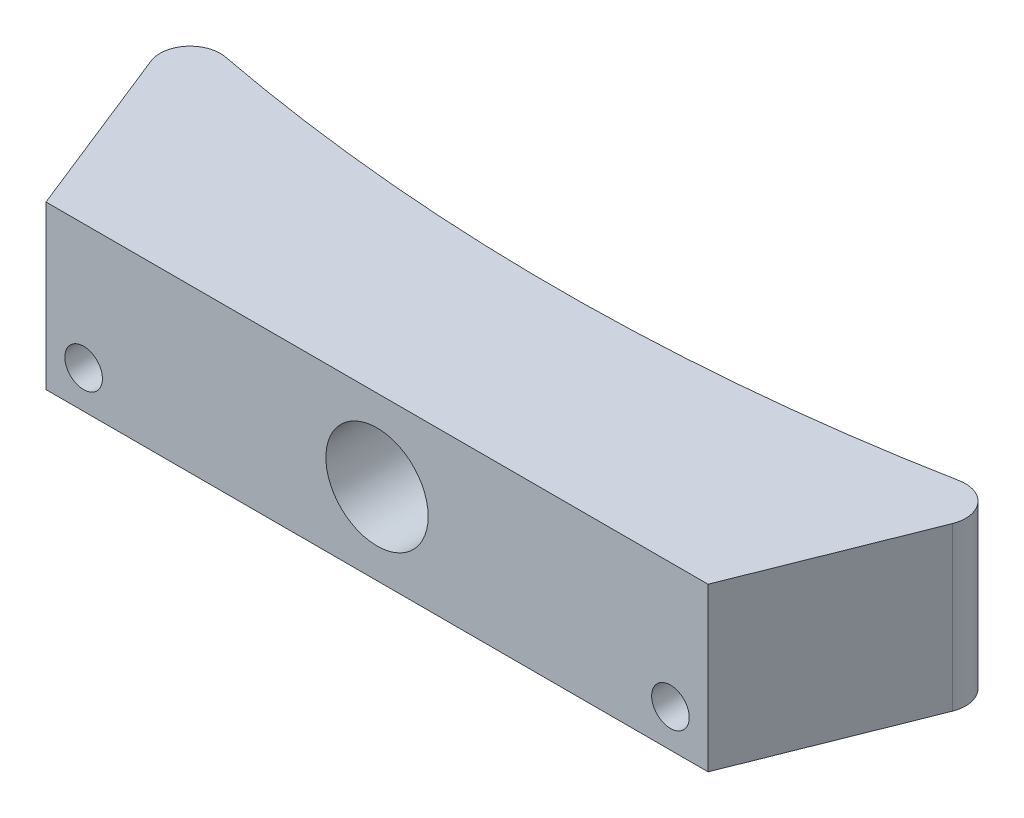
ISO-10303-21;
HEADER;
FILE_DESCRIPTION(('STEP AP214'),'2;1');
FILE_NAME('part.step','',(''),(''),'','','');
FILE_SCHEMA(('AUTOMOTIVE_DESIGN { 1 0 10303 214 1 1 1 1 }'));
ENDSEC;
DATA;
#1=APPLICATION_CONTEXT('core data for automotive mechanical design processes');
#2=APPLICATION_PROTOCOL_DEFINITION('international standard','automotive_design',2000,#1);
#3=PRODUCT_CONTEXT('',#1,'mechanical');
#4=PRODUCT('Part','Part','',(#3));
#5=PRODUCT_RELATED_PRODUCT_CATEGORY('part','',(#4));
#6=PRODUCT_DEFINITION_FORMATION('','',#4);
#7=PRODUCT_DEFINITION_CONTEXT('part definition',#1,'design');
#8=PRODUCT_DEFINITION('design','',#6,#7);
#9=PRODUCT_DEFINITION_SHAPE('','',#8);
#10=(LENGTH_UNIT() NAMED_UNIT(*) SI_UNIT(.MILLI.,.METRE.));
#11=(NAMED_UNIT(*) PLANE_ANGLE_UNIT() SI_UNIT($,.RADIAN.));
#12=(NAMED_UNIT(*) SI_UNIT($,.STERADIAN.) SOLID_ANGLE_UNIT());
#13=UNCERTAINTY_MEASURE_WITH_UNIT(LENGTH_MEASURE(1.E-05),#10,'distance_accuracy_value','');
#14=(GEOMETRIC_REPRESENTATION_CONTEXT(3) GLOBAL_UNCERTAINTY_ASSIGNED_CONTEXT((#13)) GLOBAL_UNIT_ASSIGNED_CONTEXT((#10,
#11,#12)) REPRESENTATION_CONTEXT('',''));
#15=CARTESIAN_POINT('',(0.,0.,0.));
#16=DIRECTION('',(0.,0.,1.));
#17=DIRECTION('',(1.,0.,0.));
#18=AXIS2_PLACEMENT_3D('',#15,#16,#17);
#19=CARTESIAN_POINT('',(-22.,5.4,0.));
#20=DIRECTION('',(0.,0.,1.));
#21=DIRECTION('',(1.,0.,0.));
#22=AXIS2_PLACEMENT_3D('',#19,#20,#21);
#23=PLANE('',#22);
#24=CARTESIAN_POINT('',(0.,0.,0.));
#25=DIRECTION('',(0.,0.,1.));
#26=DIRECTION('',(1.,0.,0.));
#27=AXIS2_PLACEMENT_3D('',#24,#25,#26);
#28=CIRCLE('',#27,3.4);
#29=CARTESIAN_POINT('',(3.4,0.,0.));
#30=VERTEX_POINT('',#29);
#31=EDGE_CURVE('E109',#30,#30,#28,.T.);
#32=ORIENTED_EDGE('',*,*,#31,.F.);
#33=EDGE_LOOP('',(#32));
#34=FACE_BOUND('',#33,.T.);
#35=DIRECTION('',(-1.,0.,0.));
#36=VECTOR('',#35,1.);
#37=CARTESIAN_POINT('',(-22.,5.4,0.));
#38=LINE('',#37,#36);
#39=CARTESIAN_POINT('',(22.,5.4,0.));
#40=VERTEX_POINT('',#39);
#41=CARTESIAN_POINT('',(-22.,5.4,0.));
#42=VERTEX_POINT('',#41);
#43=EDGE_CURVE('E134',#40,#42,#38,.T.);
#44=ORIENTED_EDGE('',*,*,#43,.T.);
#45=DIRECTION('',(0.,-1.,0.));
#46=VECTOR('',#45,1.);
#47=CARTESIAN_POINT('',(-22.,5.4,0.));
#48=LINE('',#47,#46);
#49=CARTESIAN_POINT('',(-22.,-5.4,0.));
#50=VERTEX_POINT('',#49);
#51=EDGE_CURVE('E145',#42,#50,#48,.T.);
#52=ORIENTED_EDGE('',*,*,#51,.T.);
#53=DIRECTION('',(-1.,0.,0.));
#54=VECTOR('',#53,1.);
#55=CARTESIAN_POINT('',(-22.,-5.4,0.));
#56=LINE('',#55,#54);
#57=CARTESIAN_POINT('',(22.,-5.4,0.));
#58=VERTEX_POINT('',#57);
#59=EDGE_CURVE('E130',#58,#50,#56,.T.);
#60=ORIENTED_EDGE('',*,*,#59,.F.);
#61=DIRECTION('',(0.,-1.,0.));
#62=VECTOR('',#61,1.);
#63=CARTESIAN_POINT('',(22.,5.4,0.));
#64=LINE('',#63,#62);
#65=EDGE_CURVE('E136',#40,#58,#64,.T.);
#66=ORIENTED_EDGE('',*,*,#65,.F.);
#67=EDGE_LOOP('',(#44,#52,#60,#66));
#68=FACE_BOUND('',#67,.T.);
#69=CARTESIAN_POINT('',(-19.5,-2.9,0.));
#70=DIRECTION('',(0.,0.,1.));
#71=DIRECTION('',(1.,0.,0.));
#72=AXIS2_PLACEMENT_3D('',#69,#70,#71);
#73=CIRCLE('',#72,1.25);
#74=CARTESIAN_POINT('',(-18.25,-2.9,0.));
#75=VERTEX_POINT('',#74);
#76=EDGE_CURVE('E108',#75,#75,#73,.T.);
#77=ORIENTED_EDGE('',*,*,#76,.F.);
#78=EDGE_LOOP('',(#77));
#79=FACE_BOUND('',#78,.T.);
#80=CARTESIAN_POINT('',(19.5,-2.9,0.));
#81=DIRECTION('',(0.,0.,1.));
#82=DIRECTION('',(1.,0.,0.));
#83=AXIS2_PLACEMENT_3D('',#80,#81,#82);
#84=CIRCLE('',#83,1.25);
#85=CARTESIAN_POINT('',(20.75,-2.9,0.));
#86=VERTEX_POINT('',#85);
#87=EDGE_CURVE('E119',#86,#86,#84,.T.);
#88=ORIENTED_EDGE('',*,*,#87,.F.);
#89=EDGE_LOOP('',(#88));
#90=FACE_BOUND('',#89,.T.);
#91=ADVANCED_FACE('F38',(#34,#68,#79,#90),#23,.T.);
#92=CARTESIAN_POINT('',(-22.,5.4,0.));
#93=DIRECTION('',(-0.928911827201936,0.,0.370300982019168));
#94=DIRECTION('',(0.370300982019168,0.,0.928911827201936));
#95=AXIS2_PLACEMENT_3D('',#92,#93,#94);
#96=PLANE('',#95);
#97=DIRECTION('',(-0.370300982019168,0.,-0.928911827201936));
#98=VECTOR('',#97,1.);
#99=CARTESIAN_POINT('',(-22.,5.4,0.));
#100=LINE('',#99,#98);
#101=CARTESIAN_POINT('',(-26.6257725120182,5.4,-11.6038979236001));
#102=VERTEX_POINT('',#101);
#103=EDGE_CURVE('E126',#42,#102,#100,.T.);
#104=ORIENTED_EDGE('',*,*,#103,.T.);
#105=DIRECTION('',(0.,-1.,0.));
#106=VECTOR('',#105,1.);
#107=CARTESIAN_POINT('',(-26.6257725120182,5.4,-11.6038979236001));
#108=LINE('',#107,#106);
#109=CARTESIAN_POINT('',(-26.6257725120182,-5.4,-11.6038979236001));
#110=VERTEX_POINT('',#109);
#111=EDGE_CURVE('E148',#102,#110,#108,.T.);
#112=ORIENTED_EDGE('',*,*,#111,.T.);
#113=DIRECTION('',(-0.370300982019168,0.,-0.928911827201936));
#114=VECTOR('',#113,1.);
#115=CARTESIAN_POINT('',(-22.,-5.4,0.));
#116=LINE('',#115,#114);
#117=EDGE_CURVE('E125',#50,#110,#116,.T.);
#118=ORIENTED_EDGE('',*,*,#117,.F.);
#119=ORIENTED_EDGE('',*,*,#51,.F.);
#120=EDGE_LOOP('',(#104,#112,#118,#119));
#121=FACE_BOUND('',#120,.T.);
#122=ADVANCED_FACE('F171',(#121),#96,.T.);
#123=CARTESIAN_POINT('',(28.,5.4,-15.0511914195332));
#124=DIRECTION('',(0.928911827201936,0.,0.370300982019168));
#125=DIRECTION('',(0.370300982019168,0.,-0.928911827201936));
#126=AXIS2_PLACEMENT_3D('',#123,#124,#125);
#127=PLANE('',#126);
#128=DIRECTION('',(-0.370300982019168,0.,0.928911827201936));
#129=VECTOR('',#128,1.);
#130=CARTESIAN_POINT('',(28.,-5.4,-15.0511914195332));
#131=LINE('',#130,#129);
#132=CARTESIAN_POINT('',(26.6257725120182,-5.4,-11.6038979236001));
#133=VERTEX_POINT('',#132);
#134=EDGE_CURVE('E142',#133,#58,#131,.T.);
#135=ORIENTED_EDGE('',*,*,#134,.F.);
#136=DIRECTION('',(0.,-1.,0.));
#137=VECTOR('',#136,1.);
#138=CARTESIAN_POINT('',(26.6257725120182,5.4,-11.6038979236001));
#139=LINE('',#138,#137);
#140=CARTESIAN_POINT('',(26.6257725120182,5.4,-11.6038979236001));
#141=VERTEX_POINT('',#140);
#142=EDGE_CURVE('E11',#133,#141,#139,.F.);
#143=ORIENTED_EDGE('',*,*,#142,.T.);
#144=DIRECTION('',(-0.370300982019168,0.,0.928911827201936));
#145=VECTOR('',#144,1.);
#146=CARTESIAN_POINT('',(28.,5.4,-15.0511914195332));
#147=LINE('',#146,#145);
#148=EDGE_CURVE('E132',#141,#40,#147,.T.);
#149=ORIENTED_EDGE('',*,*,#148,.T.);
#150=ORIENTED_EDGE('',*,*,#65,.T.);
#151=EDGE_LOOP('',(#135,#143,#149,#150));
#152=FACE_BOUND('',#151,.T.);
#153=ADVANCED_FACE('F181',(#152),#127,.T.);
#154=CARTESIAN_POINT('',(0.,5.4,-142.));
#155=DIRECTION('',(0.,-1.,0.));
#156=DIRECTION('',(0.,0.,-1.));
#157=AXIS2_PLACEMENT_3D('',#154,#155,#156);
#158=CYLINDRICAL_SURFACE('',#157,130.);
#159=CARTESIAN_POINT('',(0.,-5.4,-142.));
#160=DIRECTION('',(0.,1.,0.));
#161=DIRECTION('',(0.,0.,1.));
#162=AXIS2_PLACEMENT_3D('',#159,#160,#161);
#163=CIRCLE('',#162,130.);
#164=CARTESIAN_POINT('',(-24.3926769052262,-5.4,-14.3089771620681));
#165=VERTEX_POINT('',#164);
#166=CARTESIAN_POINT('',(24.3926769052262,-5.4,-14.3089771620681));
#167=VERTEX_POINT('',#166);
#168=EDGE_CURVE('E139',#165,#167,#163,.T.);
#169=ORIENTED_EDGE('',*,*,#168,.F.);
#170=DIRECTION('',(0.,-1.,0.));
#171=VECTOR('',#170,1.);
#172=CARTESIAN_POINT('',(-24.3926769052262,5.4,-14.3089771620681));
#173=LINE('',#172,#171);
#174=CARTESIAN_POINT('',(-24.3926769052262,5.4,-14.3089771620681));
#175=VERTEX_POINT('',#174);
#176=EDGE_CURVE('E160',#165,#175,#173,.F.);
#177=ORIENTED_EDGE('',*,*,#176,.T.);
#178=CARTESIAN_POINT('',(0.,5.4,-142.));
#179=DIRECTION('',(0.,1.,0.));
#180=DIRECTION('',(0.,0.,1.));
#181=AXIS2_PLACEMENT_3D('',#178,#179,#180);
#182=CIRCLE('',#181,130.);
#183=CARTESIAN_POINT('',(24.3926769052262,5.4,-14.3089771620681));
#184=VERTEX_POINT('',#183);
#185=EDGE_CURVE('E129',#175,#184,#182,.T.);
#186=ORIENTED_EDGE('',*,*,#185,.T.);
#187=DIRECTION('',(0.,-1.,0.));
#188=VECTOR('',#187,1.);
#189=CARTESIAN_POINT('',(24.3926769052262,5.4,-14.3089771620681));
#190=LINE('',#189,#188);
#191=EDGE_CURVE('E157',#184,#167,#190,.T.);
#192=ORIENTED_EDGE('',*,*,#191,.T.);
#193=EDGE_LOOP('',(#169,#177,#186,#192));
#194=FACE_BOUND('',#193,.T.);
#195=ADVANCED_FACE('F178',(#194),#158,.F.);
#196=CARTESIAN_POINT('',(0.,5.4,-142.));
#197=DIRECTION('',(0.,1.,0.));
#198=DIRECTION('',(0.,0.,1.));
#199=AXIS2_PLACEMENT_3D('',#196,#197,#198);
#200=PLANE('',#199);
#201=ORIENTED_EDGE('',*,*,#185,.F.);
#202=CARTESIAN_POINT('',(-24.7679488576143,5.4,-12.3444998876384));
#203=DIRECTION('',(0.,1.,0.));
#204=DIRECTION('',(0.,0.,1.));
#205=AXIS2_PLACEMENT_3D('',#202,#203,#204);
#206=CIRCLE('',#205,2.);
#207=EDGE_CURVE('E46',#175,#102,#206,.T.);
#208=ORIENTED_EDGE('',*,*,#207,.T.);
#209=ORIENTED_EDGE('',*,*,#103,.F.);
#210=ORIENTED_EDGE('',*,*,#43,.F.);
#211=ORIENTED_EDGE('',*,*,#148,.F.);
#212=CARTESIAN_POINT('',(24.7679488576143,5.4,-12.3444998876384));
#213=DIRECTION('',(0.,1.,0.));
#214=DIRECTION('',(0.,0.,1.));
#215=AXIS2_PLACEMENT_3D('',#212,#213,#214);
#216=CIRCLE('',#215,2.);
#217=EDGE_CURVE('E58',#141,#184,#216,.T.);
#218=ORIENTED_EDGE('',*,*,#217,.T.);
#219=EDGE_LOOP('',(#201,#208,#209,#210,#211,#218));
#220=FACE_BOUND('',#219,.T.);
#221=ADVANCED_FACE('F164',(#220),#200,.T.);
#222=CARTESIAN_POINT('',(0.,-5.4,-142.));
#223=DIRECTION('',(0.,1.,0.));
#224=DIRECTION('',(0.,0.,1.));
#225=AXIS2_PLACEMENT_3D('',#222,#223,#224);
#226=PLANE('',#225);
#227=ORIENTED_EDGE('',*,*,#117,.T.);
#228=CARTESIAN_POINT('',(-24.7679488576143,-5.4,-12.3444998876384));
#229=DIRECTION('',(0.,1.,0.));
#230=DIRECTION('',(0.,0.,1.));
#231=AXIS2_PLACEMENT_3D('',#228,#229,#230);
#232=CIRCLE('',#231,2.);
#233=EDGE_CURVE('E155',#110,#165,#232,.F.);
#234=ORIENTED_EDGE('',*,*,#233,.T.);
#235=ORIENTED_EDGE('',*,*,#168,.T.);
#236=CARTESIAN_POINT('',(24.7679488576143,-5.4,-12.3444998876384));
#237=DIRECTION('',(0.,1.,0.));
#238=DIRECTION('',(0.,0.,1.));
#239=AXIS2_PLACEMENT_3D('',#236,#237,#238);
#240=CIRCLE('',#239,2.);
#241=EDGE_CURVE('E153',#167,#133,#240,.F.);
#242=ORIENTED_EDGE('',*,*,#241,.T.);
#243=ORIENTED_EDGE('',*,*,#134,.T.);
#244=ORIENTED_EDGE('',*,*,#59,.T.);
#245=EDGE_LOOP('',(#227,#234,#235,#242,#243,#244));
#246=FACE_BOUND('',#245,.T.);
#247=ADVANCED_FACE('F176',(#246),#226,.F.);
#248=CARTESIAN_POINT('',(19.5,-2.9,-7.5));
#249=DIRECTION('',(0.,0.,1.));
#250=DIRECTION('',(1.,0.,0.));
#251=AXIS2_PLACEMENT_3D('',#248,#249,#250);
#252=CONICAL_SURFACE('',#251,1.25,1.02974425867665);
#253=CARTESIAN_POINT('',(19.5,-2.9,-8.25107577378445));
#254=VERTEX_POINT('',#253);
#255=VERTEX_LOOP('',#254);
#256=FACE_BOUND('',#255,.T.);
#257=CARTESIAN_POINT('',(19.5,-2.9,-7.5));
#258=DIRECTION('',(0.,0.,1.));
#259=DIRECTION('',(1.,0.,0.));
#260=AXIS2_PLACEMENT_3D('',#257,#258,#259);
#261=CIRCLE('',#260,1.25);
#262=CARTESIAN_POINT('',(20.75,-2.9,-7.5));
#263=VERTEX_POINT('',#262);
#264=EDGE_CURVE('E122',#263,#263,#261,.T.);
#265=ORIENTED_EDGE('',*,*,#264,.T.);
#266=EDGE_LOOP('',(#265));
#267=FACE_BOUND('',#266,.T.);
#268=ADVANCED_FACE('F196',(#256,#267),#252,.F.);
#269=CARTESIAN_POINT('',(19.5,-2.9,0.));
#270=DIRECTION('',(0.,0.,1.));
#271=DIRECTION('',(1.,0.,0.));
#272=AXIS2_PLACEMENT_3D('',#269,#270,#271);
#273=CYLINDRICAL_SURFACE('',#272,1.25);
#274=ORIENTED_EDGE('',*,*,#264,.F.);
#275=EDGE_LOOP('',(#274));
#276=FACE_BOUND('',#275,.T.);
#277=ORIENTED_EDGE('',*,*,#87,.T.);
#278=EDGE_LOOP('',(#277));
#279=FACE_BOUND('',#278,.T.);
#280=ADVANCED_FACE('F193',(#276,#279),#273,.F.);
#281=CARTESIAN_POINT('',(-19.5,-2.9,-7.5));
#282=DIRECTION('',(0.,0.,1.));
#283=DIRECTION('',(1.,0.,0.));
#284=AXIS2_PLACEMENT_3D('',#281,#282,#283);
#285=CONICAL_SURFACE('',#284,1.25,1.02974425867665);
#286=CARTESIAN_POINT('',(-19.5,-2.9,-8.25107577378445));
#287=VERTEX_POINT('',#286);
#288=VERTEX_LOOP('',#287);
#289=FACE_BOUND('',#288,.T.);
#290=CARTESIAN_POINT('',(-19.5,-2.9,-7.5));
#291=DIRECTION('',(0.,0.,1.));
#292=DIRECTION('',(1.,0.,0.));
#293=AXIS2_PLACEMENT_3D('',#290,#291,#292);
#294=CIRCLE('',#293,1.25);
#295=CARTESIAN_POINT('',(-18.25,-2.9,-7.5));
#296=VERTEX_POINT('',#295);
#297=EDGE_CURVE('E112',#296,#296,#294,.T.);
#298=ORIENTED_EDGE('',*,*,#297,.T.);
#299=EDGE_LOOP('',(#298));
#300=FACE_BOUND('',#299,.T.);
#301=ADVANCED_FACE('F195',(#289,#300),#285,.F.);
#302=CARTESIAN_POINT('',(-19.5,-2.9,0.));
#303=DIRECTION('',(0.,0.,1.));
#304=DIRECTION('',(1.,0.,0.));
#305=AXIS2_PLACEMENT_3D('',#302,#303,#304);
#306=CYLINDRICAL_SURFACE('',#305,1.25);
#307=ORIENTED_EDGE('',*,*,#297,.F.);
#308=EDGE_LOOP('',(#307));
#309=FACE_BOUND('',#308,.T.);
#310=ORIENTED_EDGE('',*,*,#76,.T.);
#311=EDGE_LOOP('',(#310));
#312=FACE_BOUND('',#311,.T.);
#313=ADVANCED_FACE('F102',(#309,#312),#306,.F.);
#314=CARTESIAN_POINT('',(0.,0.,-9.));
#315=DIRECTION('',(0.,0.,1.));
#316=DIRECTION('',(1.,0.,0.));
#317=AXIS2_PLACEMENT_3D('',#314,#315,#316);
#318=CONICAL_SURFACE('',#317,3.4,1.02974425867665);
#319=CARTESIAN_POINT('',(0.,0.,-11.0429261046937));
#320=VERTEX_POINT('',#319);
#321=VERTEX_LOOP('',#320);
#322=FACE_BOUND('',#321,.T.);
#323=CARTESIAN_POINT('',(0.,0.,-9.));
#324=DIRECTION('',(0.,0.,1.));
#325=DIRECTION('',(1.,0.,0.));
#326=AXIS2_PLACEMENT_3D('',#323,#324,#325);
#327=CIRCLE('',#326,3.4);
#328=CARTESIAN_POINT('',(3.4,0.,-9.));
#329=VERTEX_POINT('',#328);
#330=EDGE_CURVE('E106',#329,#329,#327,.T.);
#331=ORIENTED_EDGE('',*,*,#330,.T.);
#332=EDGE_LOOP('',(#331));
#333=FACE_BOUND('',#332,.T.);
#334=ADVANCED_FACE('F98',(#322,#333),#318,.F.);
#335=CARTESIAN_POINT('',(0.,0.,0.));
#336=DIRECTION('',(0.,0.,1.));
#337=DIRECTION('',(1.,0.,0.));
#338=AXIS2_PLACEMENT_3D('',#335,#336,#337);
#339=CYLINDRICAL_SURFACE('',#338,3.4);
#340=ORIENTED_EDGE('',*,*,#330,.F.);
#341=EDGE_LOOP('',(#340));
#342=FACE_BOUND('',#341,.T.);
#343=ORIENTED_EDGE('',*,*,#31,.T.);
#344=EDGE_LOOP('',(#343));
#345=FACE_BOUND('',#344,.T.);
#346=ADVANCED_FACE('F101',(#342,#345),#339,.F.);
#347=CARTESIAN_POINT('',(-24.7679488576143,5.4,-12.3444998876384));
#348=DIRECTION('',(0.,-1.,0.));
#349=DIRECTION('',(0.,0.,-1.));
#350=AXIS2_PLACEMENT_3D('',#347,#348,#349);
#351=CYLINDRICAL_SURFACE('',#350,2.);
#352=ORIENTED_EDGE('',*,*,#207,.F.);
#353=ORIENTED_EDGE('',*,*,#176,.F.);
#354=ORIENTED_EDGE('',*,*,#233,.F.);
#355=ORIENTED_EDGE('',*,*,#111,.F.);
#356=EDGE_LOOP('',(#352,#353,#354,#355));
#357=FACE_BOUND('',#356,.T.);
#358=ADVANCED_FACE('F173',(#357),#351,.T.);
#359=CARTESIAN_POINT('',(24.7679488576143,5.4,-12.3444998876384));
#360=DIRECTION('',(0.,-1.,0.));
#361=DIRECTION('',(0.,0.,-1.));
#362=AXIS2_PLACEMENT_3D('',#359,#360,#361);
#363=CYLINDRICAL_SURFACE('',#362,2.);
#364=ORIENTED_EDGE('',*,*,#217,.F.);
#365=ORIENTED_EDGE('',*,*,#142,.F.);
#366=ORIENTED_EDGE('',*,*,#241,.F.);
#367=ORIENTED_EDGE('',*,*,#191,.F.);
#368=EDGE_LOOP('',(#364,#365,#366,#367));
#369=FACE_BOUND('',#368,.T.);
#370=ADVANCED_FACE('F40',(#369),#363,.T.);
#371=CLOSED_SHELL('',(#91,#122,#153,#195,#221,#247,#268,#280,#301,#313,#334,#346,#358,#370));
#372=MANIFOLD_SOLID_BREP('B2',#371);
#373=ADVANCED_BREP_SHAPE_REPRESENTATION('',(#18,#372),#14);
#374=SHAPE_DEFINITION_REPRESENTATION(#9,#373);
ENDSEC;
END-ISO-10303-21;
